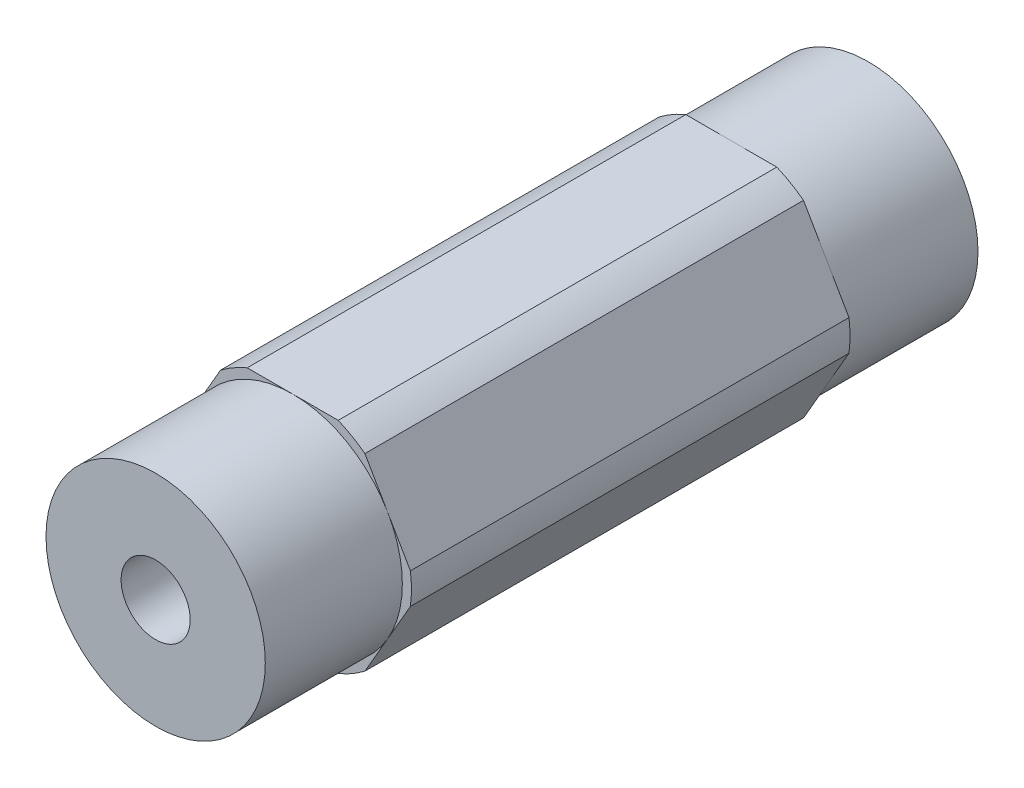
ISO-10303-21;
HEADER;
FILE_DESCRIPTION(('STEP AP214'),'2;1');
FILE_NAME('part.step','',(''),(''),'','','');
FILE_SCHEMA(('AUTOMOTIVE_DESIGN { 1 0 10303 214 1 1 1 1 }'));
ENDSEC;
DATA;
#1=APPLICATION_CONTEXT('core data for automotive mechanical design processes');
#2=APPLICATION_PROTOCOL_DEFINITION('international standard','automotive_design',2000,#1);
#3=PRODUCT_CONTEXT('',#1,'mechanical');
#4=PRODUCT('Part','Part','',(#3));
#5=PRODUCT_RELATED_PRODUCT_CATEGORY('part','',(#4));
#6=PRODUCT_DEFINITION_FORMATION('','',#4);
#7=PRODUCT_DEFINITION_CONTEXT('part definition',#1,'design');
#8=PRODUCT_DEFINITION('design','',#6,#7);
#9=PRODUCT_DEFINITION_SHAPE('','',#8);
#10=(LENGTH_UNIT() NAMED_UNIT(*) SI_UNIT(.MILLI.,.METRE.));
#11=(NAMED_UNIT(*) PLANE_ANGLE_UNIT() SI_UNIT($,.RADIAN.));
#12=(NAMED_UNIT(*) SI_UNIT($,.STERADIAN.) SOLID_ANGLE_UNIT());
#13=UNCERTAINTY_MEASURE_WITH_UNIT(LENGTH_MEASURE(1.E-05),#10,'distance_accuracy_value','');
#14=(GEOMETRIC_REPRESENTATION_CONTEXT(3) GLOBAL_UNCERTAINTY_ASSIGNED_CONTEXT((#13)) GLOBAL_UNIT_ASSIGNED_CONTEXT((#10,
#11,#12)) REPRESENTATION_CONTEXT('',''));
#15=CARTESIAN_POINT('',(0.,0.,0.));
#16=DIRECTION('',(0.,0.,1.));
#17=DIRECTION('',(1.,0.,0.));
#18=AXIS2_PLACEMENT_3D('',#15,#16,#17);
#19=CARTESIAN_POINT('',(0.,0.,-12.7));
#20=DIRECTION('',(0.,0.,1.));
#21=DIRECTION('',(1.,0.,0.));
#22=AXIS2_PLACEMENT_3D('',#19,#20,#21);
#23=PLANE('',#22);
#24=DIRECTION('',(-0.5,0.866025403784439,0.));
#25=VECTOR('',#24,1.);
#26=CARTESIAN_POINT('',(5.49926131403118,3.175,-12.7));
#27=LINE('',#26,#25);
#28=CARTESIAN_POINT('',(5.49926131403118,3.175,-12.7));
#29=VERTEX_POINT('',#28);
#30=CARTESIAN_POINT('',(4.18177084608654,5.45696042896782,-12.7));
#31=VERTEX_POINT('',#30);
#32=EDGE_CURVE('E177',#29,#31,#27,.T.);
#33=ORIENTED_EDGE('',*,*,#32,.F.);
#34=CARTESIAN_POINT('',(0.,0.,-12.7));
#35=DIRECTION('',(0.,0.,1.));
#36=DIRECTION('',(1.,0.,0.));
#37=AXIS2_PLACEMENT_3D('',#34,#35,#36);
#38=CIRCLE('',#37,6.35);
#39=CARTESIAN_POINT('',(0.,6.35,-12.7));
#40=VERTEX_POINT('',#39);
#41=EDGE_CURVE('E52',#29,#40,#38,.T.);
#42=ORIENTED_EDGE('',*,*,#41,.T.);
#43=DIRECTION('',(-1.,0.,0.));
#44=VECTOR('',#43,1.);
#45=CARTESIAN_POINT('',(0.,6.35,-12.7));
#46=LINE('',#45,#44);
#47=CARTESIAN_POINT('',(2.63498093588929,6.35,-12.7));
#48=VERTEX_POINT('',#47);
#49=EDGE_CURVE('E176',#48,#40,#46,.T.);
#50=ORIENTED_EDGE('',*,*,#49,.F.);
#51=CARTESIAN_POINT('',(0.,0.,-12.7));
#52=DIRECTION('',(0.,0.,1.));
#53=DIRECTION('',(1.,0.,0.));
#54=AXIS2_PLACEMENT_3D('',#51,#52,#53);
#55=CIRCLE('',#54,6.874999966);
#56=EDGE_CURVE('E191',#31,#48,#55,.T.);
#57=ORIENTED_EDGE('',*,*,#56,.F.);
#58=EDGE_LOOP('',(#33,#42,#50,#57));
#59=FACE_BOUND('',#58,.T.);
#60=ADVANCED_FACE('F40',(#59),#23,.F.);
#61=CARTESIAN_POINT('',(-2.63498093588929,6.35,-12.7));
#62=VERTEX_POINT('',#61);
#63=EDGE_CURVE('E184',#40,#62,#46,.T.);
#64=ORIENTED_EDGE('',*,*,#63,.F.);
#65=CARTESIAN_POINT('',(-5.49926131403118,3.175,-12.7));
#66=VERTEX_POINT('',#65);
#67=EDGE_CURVE('E11',#40,#66,#38,.T.);
#68=ORIENTED_EDGE('',*,*,#67,.T.);
#69=DIRECTION('',(-0.5,-0.866025403784438,0.));
#70=VECTOR('',#69,1.);
#71=CARTESIAN_POINT('',(-5.49926131403118,3.175,-12.7));
#72=LINE('',#71,#70);
#73=CARTESIAN_POINT('',(-4.18177084608654,5.45696042896783,-12.7));
#74=VERTEX_POINT('',#73);
#75=EDGE_CURVE('E206',#74,#66,#72,.T.);
#76=ORIENTED_EDGE('',*,*,#75,.F.);
#77=EDGE_CURVE('E186',#62,#74,#55,.T.);
#78=ORIENTED_EDGE('',*,*,#77,.F.);
#79=EDGE_LOOP('',(#64,#68,#76,#78));
#80=FACE_BOUND('',#79,.T.);
#81=ADVANCED_FACE('F185',(#80),#23,.F.);
#82=CARTESIAN_POINT('',(-6.81675178197583,0.893039571032178,-12.7));
#83=VERTEX_POINT('',#82);
#84=EDGE_CURVE('E201',#66,#83,#72,.T.);
#85=ORIENTED_EDGE('',*,*,#84,.F.);
#86=CARTESIAN_POINT('',(-5.49926131403118,-3.175,-12.7));
#87=VERTEX_POINT('',#86);
#88=EDGE_CURVE('E50',#66,#87,#38,.T.);
#89=ORIENTED_EDGE('',*,*,#88,.T.);
#90=DIRECTION('',(0.5,-0.866025403784438,0.));
#91=VECTOR('',#90,1.);
#92=CARTESIAN_POINT('',(-5.49926131403118,-3.175,-12.7));
#93=LINE('',#92,#91);
#94=CARTESIAN_POINT('',(-6.81675178197583,-0.893039571032174,-12.7));
#95=VERTEX_POINT('',#94);
#96=EDGE_CURVE('E210',#95,#87,#93,.T.);
#97=ORIENTED_EDGE('',*,*,#96,.F.);
#98=EDGE_CURVE('E203',#83,#95,#55,.T.);
#99=ORIENTED_EDGE('',*,*,#98,.F.);
#100=EDGE_LOOP('',(#85,#89,#97,#99));
#101=FACE_BOUND('',#100,.T.);
#102=ADVANCED_FACE('F464',(#101),#23,.F.);
#103=CARTESIAN_POINT('',(-4.18177084608653,-5.45696042896783,-12.7));
#104=VERTEX_POINT('',#103);
#105=EDGE_CURVE('E215',#87,#104,#93,.T.);
#106=ORIENTED_EDGE('',*,*,#105,.F.);
#107=CARTESIAN_POINT('',(0.,-6.35,-12.7));
#108=VERTEX_POINT('',#107);
#109=EDGE_CURVE('E411',#87,#108,#38,.T.);
#110=ORIENTED_EDGE('',*,*,#109,.T.);
#111=DIRECTION('',(1.,0.,0.));
#112=VECTOR('',#111,1.);
#113=CARTESIAN_POINT('',(0.,-6.35,-12.7));
#114=LINE('',#113,#112);
#115=CARTESIAN_POINT('',(-2.6349809358893,-6.35,-12.7));
#116=VERTEX_POINT('',#115);
#117=EDGE_CURVE('E216',#116,#108,#114,.T.);
#118=ORIENTED_EDGE('',*,*,#117,.F.);
#119=EDGE_CURVE('E214',#104,#116,#55,.T.);
#120=ORIENTED_EDGE('',*,*,#119,.F.);
#121=EDGE_LOOP('',(#106,#110,#118,#120));
#122=FACE_BOUND('',#121,.T.);
#123=ADVANCED_FACE('F410',(#122),#23,.F.);
#124=CARTESIAN_POINT('',(2.6349809358893,-6.35,-12.7));
#125=VERTEX_POINT('',#124);
#126=EDGE_CURVE('E221',#108,#125,#114,.T.);
#127=ORIENTED_EDGE('',*,*,#126,.F.);
#128=CARTESIAN_POINT('',(5.49926131403118,-3.175,-12.7));
#129=VERTEX_POINT('',#128);
#130=EDGE_CURVE('E305',#108,#129,#38,.T.);
#131=ORIENTED_EDGE('',*,*,#130,.T.);
#132=DIRECTION('',(0.5,0.866025403784439,0.));
#133=VECTOR('',#132,1.);
#134=CARTESIAN_POINT('',(5.49926131403119,-3.175,-12.7));
#135=LINE('',#134,#133);
#136=CARTESIAN_POINT('',(4.18177084608654,-5.45696042896782,-12.7));
#137=VERTEX_POINT('',#136);
#138=EDGE_CURVE('E222',#137,#129,#135,.T.);
#139=ORIENTED_EDGE('',*,*,#138,.F.);
#140=EDGE_CURVE('E220',#125,#137,#55,.T.);
#141=ORIENTED_EDGE('',*,*,#140,.F.);
#142=EDGE_LOOP('',(#127,#131,#139,#141));
#143=FACE_BOUND('',#142,.T.);
#144=ADVANCED_FACE('F447',(#143),#23,.F.);
#145=CARTESIAN_POINT('',(0.,0.,12.7));
#146=DIRECTION('',(0.,0.,1.));
#147=DIRECTION('',(1.,0.,0.));
#148=AXIS2_PLACEMENT_3D('',#145,#146,#147);
#149=PLANE('',#148);
#150=CARTESIAN_POINT('',(0.,0.,12.7));
#151=DIRECTION('',(0.,0.,1.));
#152=DIRECTION('',(1.,0.,0.));
#153=AXIS2_PLACEMENT_3D('',#150,#151,#152);
#154=CIRCLE('',#153,6.35);
#155=CARTESIAN_POINT('',(5.49926131403118,3.175,12.7));
#156=VERTEX_POINT('',#155);
#157=CARTESIAN_POINT('',(0.,6.35,12.7));
#158=VERTEX_POINT('',#157);
#159=EDGE_CURVE('E278',#156,#158,#154,.T.);
#160=ORIENTED_EDGE('',*,*,#159,.F.);
#161=DIRECTION('',(-0.5,0.866025403784439,0.));
#162=VECTOR('',#161,1.);
#163=CARTESIAN_POINT('',(5.49926131403118,3.175,12.7));
#164=LINE('',#163,#162);
#165=CARTESIAN_POINT('',(4.18177084608654,5.45696042896782,12.7));
#166=VERTEX_POINT('',#165);
#167=EDGE_CURVE('E376',#156,#166,#164,.T.);
#168=ORIENTED_EDGE('',*,*,#167,.T.);
#169=CARTESIAN_POINT('',(0.,0.,12.7));
#170=DIRECTION('',(0.,0.,1.));
#171=DIRECTION('',(1.,0.,0.));
#172=AXIS2_PLACEMENT_3D('',#169,#170,#171);
#173=CIRCLE('',#172,6.874999966);
#174=CARTESIAN_POINT('',(2.63498093588929,6.35,12.7));
#175=VERTEX_POINT('',#174);
#176=EDGE_CURVE('E361',#166,#175,#173,.T.);
#177=ORIENTED_EDGE('',*,*,#176,.T.);
#178=DIRECTION('',(-1.,0.,0.));
#179=VECTOR('',#178,1.);
#180=CARTESIAN_POINT('',(0.,6.35,12.7));
#181=LINE('',#180,#179);
#182=EDGE_CURVE('E364',#175,#158,#181,.T.);
#183=ORIENTED_EDGE('',*,*,#182,.T.);
#184=EDGE_LOOP('',(#160,#168,#177,#183));
#185=FACE_BOUND('',#184,.T.);
#186=ADVANCED_FACE('F444',(#185),#149,.T.);
#187=CARTESIAN_POINT('',(-5.49926131403118,3.175,12.7));
#188=VERTEX_POINT('',#187);
#189=EDGE_CURVE('E290',#158,#188,#154,.T.);
#190=ORIENTED_EDGE('',*,*,#189,.F.);
#191=CARTESIAN_POINT('',(-2.63498093588929,6.35,12.7));
#192=VERTEX_POINT('',#191);
#193=EDGE_CURVE('E365',#158,#192,#181,.T.);
#194=ORIENTED_EDGE('',*,*,#193,.T.);
#195=CARTESIAN_POINT('',(-4.18177084608654,5.45696042896783,12.7));
#196=VERTEX_POINT('',#195);
#197=EDGE_CURVE('E368',#192,#196,#173,.T.);
#198=ORIENTED_EDGE('',*,*,#197,.T.);
#199=DIRECTION('',(-0.5,-0.866025403784438,0.));
#200=VECTOR('',#199,1.);
#201=CARTESIAN_POINT('',(-5.49926131403118,3.175,12.7));
#202=LINE('',#201,#200);
#203=EDGE_CURVE('E342',#196,#188,#202,.T.);
#204=ORIENTED_EDGE('',*,*,#203,.T.);
#205=EDGE_LOOP('',(#190,#194,#198,#204));
#206=FACE_BOUND('',#205,.T.);
#207=ADVANCED_FACE('F446',(#206),#149,.T.);
#208=CARTESIAN_POINT('',(-5.49926131403118,-3.175,12.7));
#209=VERTEX_POINT('',#208);
#210=EDGE_CURVE('E300',#188,#209,#154,.T.);
#211=ORIENTED_EDGE('',*,*,#210,.F.);
#212=CARTESIAN_POINT('',(-6.81675178197583,0.893039571032178,12.7));
#213=VERTEX_POINT('',#212);
#214=EDGE_CURVE('E372',#188,#213,#202,.T.);
#215=ORIENTED_EDGE('',*,*,#214,.T.);
#216=CARTESIAN_POINT('',(-6.81675178197583,-0.893039571032174,12.7));
#217=VERTEX_POINT('',#216);
#218=EDGE_CURVE('E326',#213,#217,#173,.T.);
#219=ORIENTED_EDGE('',*,*,#218,.T.);
#220=DIRECTION('',(0.5,-0.866025403784438,0.));
#221=VECTOR('',#220,1.);
#222=CARTESIAN_POINT('',(-5.49926131403118,-3.175,12.7));
#223=LINE('',#222,#221);
#224=EDGE_CURVE('E323',#217,#209,#223,.T.);
#225=ORIENTED_EDGE('',*,*,#224,.T.);
#226=EDGE_LOOP('',(#211,#215,#219,#225));
#227=FACE_BOUND('',#226,.T.);
#228=ADVANCED_FACE('F329',(#227),#149,.T.);
#229=CARTESIAN_POINT('',(0.,-6.35,12.7));
#230=VERTEX_POINT('',#229);
#231=EDGE_CURVE('E284',#209,#230,#154,.T.);
#232=ORIENTED_EDGE('',*,*,#231,.F.);
#233=CARTESIAN_POINT('',(-4.18177084608653,-5.45696042896783,12.7));
#234=VERTEX_POINT('',#233);
#235=EDGE_CURVE('E315',#209,#234,#223,.T.);
#236=ORIENTED_EDGE('',*,*,#235,.T.);
#237=CARTESIAN_POINT('',(-2.6349809358893,-6.35,12.7));
#238=VERTEX_POINT('',#237);
#239=EDGE_CURVE('E334',#234,#238,#173,.T.);
#240=ORIENTED_EDGE('',*,*,#239,.T.);
#241=DIRECTION('',(1.,0.,0.));
#242=VECTOR('',#241,1.);
#243=CARTESIAN_POINT('',(0.,-6.35,12.7));
#244=LINE('',#243,#242);
#245=EDGE_CURVE('E318',#238,#230,#244,.T.);
#246=ORIENTED_EDGE('',*,*,#245,.T.);
#247=EDGE_LOOP('',(#232,#236,#240,#246));
#248=FACE_BOUND('',#247,.T.);
#249=ADVANCED_FACE('F314',(#248),#149,.T.);
#250=CARTESIAN_POINT('',(5.49926131403119,-3.175,12.7));
#251=VERTEX_POINT('',#250);
#252=EDGE_CURVE('E276',#230,#251,#154,.T.);
#253=ORIENTED_EDGE('',*,*,#252,.F.);
#254=CARTESIAN_POINT('',(2.6349809358893,-6.35,12.7));
#255=VERTEX_POINT('',#254);
#256=EDGE_CURVE('E337',#230,#255,#244,.T.);
#257=ORIENTED_EDGE('',*,*,#256,.T.);
#258=CARTESIAN_POINT('',(4.18177084608654,-5.45696042896782,12.7));
#259=VERTEX_POINT('',#258);
#260=EDGE_CURVE('E339',#255,#259,#173,.T.);
#261=ORIENTED_EDGE('',*,*,#260,.T.);
#262=DIRECTION('',(0.5,0.866025403784439,0.));
#263=VECTOR('',#262,1.);
#264=CARTESIAN_POINT('',(5.49926131403119,-3.175,12.7));
#265=LINE('',#264,#263);
#266=EDGE_CURVE('E346',#259,#251,#265,.T.);
#267=ORIENTED_EDGE('',*,*,#266,.T.);
#268=EDGE_LOOP('',(#253,#257,#261,#267));
#269=FACE_BOUND('',#268,.T.);
#270=ADVANCED_FACE('F459',(#269),#149,.T.);
#271=CARTESIAN_POINT('',(5.49926131403118,3.175,12.7));
#272=DIRECTION('',(-0.866025403784438,-0.5,0.));
#273=DIRECTION('',(0.5,-0.866025403784439,0.));
#274=AXIS2_PLACEMENT_3D('',#271,#272,#273);
#275=PLANE('',#274);
#276=CARTESIAN_POINT('',(6.81675178197583,0.89303957103218,-12.7));
#277=VERTEX_POINT('',#276);
#278=EDGE_CURVE('E350',#277,#29,#27,.T.);
#279=ORIENTED_EDGE('',*,*,#278,.T.);
#280=ORIENTED_EDGE('',*,*,#32,.T.);
#281=DIRECTION('',(0.,0.,-1.));
#282=VECTOR('',#281,1.);
#283=CARTESIAN_POINT('',(4.18177084608654,5.45696042896782,12.7));
#284=LINE('',#283,#282);
#285=EDGE_CURVE('E44',#166,#31,#284,.T.);
#286=ORIENTED_EDGE('',*,*,#285,.F.);
#287=ORIENTED_EDGE('',*,*,#167,.F.);
#288=CARTESIAN_POINT('',(6.81675178197583,0.89303957103218,12.7));
#289=VERTEX_POINT('',#288);
#290=EDGE_CURVE('E374',#289,#156,#164,.T.);
#291=ORIENTED_EDGE('',*,*,#290,.F.);
#292=DIRECTION('',(0.,0.,-1.));
#293=VECTOR('',#292,1.);
#294=CARTESIAN_POINT('',(6.81675178197583,0.89303957103218,12.7));
#295=LINE('',#294,#293);
#296=EDGE_CURVE('E228',#289,#277,#295,.T.);
#297=ORIENTED_EDGE('',*,*,#296,.T.);
#298=EDGE_LOOP('',(#279,#280,#286,#287,#291,#297));
#299=FACE_BOUND('',#298,.T.);
#300=ADVANCED_FACE('F358',(#299),#275,.F.);
#301=CARTESIAN_POINT('',(0.,0.,12.7));
#302=DIRECTION('',(0.,0.,-1.));
#303=DIRECTION('',(-1.,0.,0.));
#304=AXIS2_PLACEMENT_3D('',#301,#302,#303);
#305=CYLINDRICAL_SURFACE('',#304,6.874999966);
#306=ORIENTED_EDGE('',*,*,#56,.T.);
#307=DIRECTION('',(0.,0.,-1.));
#308=VECTOR('',#307,1.);
#309=CARTESIAN_POINT('',(2.63498093588929,6.35,12.7));
#310=LINE('',#309,#308);
#311=EDGE_CURVE('E197',#175,#48,#310,.T.);
#312=ORIENTED_EDGE('',*,*,#311,.F.);
#313=ORIENTED_EDGE('',*,*,#176,.F.);
#314=ORIENTED_EDGE('',*,*,#285,.T.);
#315=EDGE_LOOP('',(#306,#312,#313,#314));
#316=FACE_BOUND('',#315,.T.);
#317=ADVANCED_FACE('F360',(#316),#305,.T.);
#318=CARTESIAN_POINT('',(0.,6.35,12.7));
#319=DIRECTION('',(0.,-1.,0.));
#320=DIRECTION('',(0.,0.,-1.));
#321=AXIS2_PLACEMENT_3D('',#318,#319,#320);
#322=PLANE('',#321);
#323=ORIENTED_EDGE('',*,*,#49,.T.);
#324=ORIENTED_EDGE('',*,*,#63,.T.);
#325=DIRECTION('',(0.,0.,-1.));
#326=VECTOR('',#325,1.);
#327=CARTESIAN_POINT('',(-2.63498093588929,6.35,12.7));
#328=LINE('',#327,#326);
#329=EDGE_CURVE('E265',#192,#62,#328,.T.);
#330=ORIENTED_EDGE('',*,*,#329,.F.);
#331=ORIENTED_EDGE('',*,*,#193,.F.);
#332=ORIENTED_EDGE('',*,*,#182,.F.);
#333=ORIENTED_EDGE('',*,*,#311,.T.);
#334=EDGE_LOOP('',(#323,#324,#330,#331,#332,#333));
#335=FACE_BOUND('',#334,.T.);
#336=ADVANCED_FACE('F194',(#335),#322,.F.);
#337=ORIENTED_EDGE('',*,*,#77,.T.);
#338=DIRECTION('',(0.,0.,-1.));
#339=VECTOR('',#338,1.);
#340=CARTESIAN_POINT('',(-4.18177084608654,5.45696042896783,12.7));
#341=LINE('',#340,#339);
#342=EDGE_CURVE('E261',#196,#74,#341,.T.);
#343=ORIENTED_EDGE('',*,*,#342,.F.);
#344=ORIENTED_EDGE('',*,*,#197,.F.);
#345=ORIENTED_EDGE('',*,*,#329,.T.);
#346=EDGE_LOOP('',(#337,#343,#344,#345));
#347=FACE_BOUND('',#346,.T.);
#348=ADVANCED_FACE('F517',(#347),#305,.T.);
#349=CARTESIAN_POINT('',(-5.49926131403118,3.175,12.7));
#350=DIRECTION('',(0.866025403784438,-0.5,0.));
#351=DIRECTION('',(0.5,0.866025403784438,0.));
#352=AXIS2_PLACEMENT_3D('',#349,#350,#351);
#353=PLANE('',#352);
#354=ORIENTED_EDGE('',*,*,#75,.T.);
#355=ORIENTED_EDGE('',*,*,#84,.T.);
#356=DIRECTION('',(0.,0.,-1.));
#357=VECTOR('',#356,1.);
#358=CARTESIAN_POINT('',(-6.81675178197583,0.893039571032178,12.7));
#359=LINE('',#358,#357);
#360=EDGE_CURVE('E257',#213,#83,#359,.T.);
#361=ORIENTED_EDGE('',*,*,#360,.F.);
#362=ORIENTED_EDGE('',*,*,#214,.F.);
#363=ORIENTED_EDGE('',*,*,#203,.F.);
#364=ORIENTED_EDGE('',*,*,#342,.T.);
#365=EDGE_LOOP('',(#354,#355,#361,#362,#363,#364));
#366=FACE_BOUND('',#365,.T.);
#367=ADVANCED_FACE('F514',(#366),#353,.F.);
#368=ORIENTED_EDGE('',*,*,#98,.T.);
#369=DIRECTION('',(0.,0.,-1.));
#370=VECTOR('',#369,1.);
#371=CARTESIAN_POINT('',(-6.81675178197583,-0.893039571032174,12.7));
#372=LINE('',#371,#370);
#373=EDGE_CURVE('E253',#217,#95,#372,.T.);
#374=ORIENTED_EDGE('',*,*,#373,.F.);
#375=ORIENTED_EDGE('',*,*,#218,.F.);
#376=ORIENTED_EDGE('',*,*,#360,.T.);
#377=EDGE_LOOP('',(#368,#374,#375,#376));
#378=FACE_BOUND('',#377,.T.);
#379=ADVANCED_FACE('F513',(#378),#305,.T.);
#380=CARTESIAN_POINT('',(-5.49926131403118,-3.175,12.7));
#381=DIRECTION('',(0.866025403784438,0.5,0.));
#382=DIRECTION('',(-0.5,0.866025403784438,0.));
#383=AXIS2_PLACEMENT_3D('',#380,#381,#382);
#384=PLANE('',#383);
#385=ORIENTED_EDGE('',*,*,#96,.T.);
#386=ORIENTED_EDGE('',*,*,#105,.T.);
#387=DIRECTION('',(0.,0.,-1.));
#388=VECTOR('',#387,1.);
#389=CARTESIAN_POINT('',(-4.18177084608653,-5.45696042896783,12.7));
#390=LINE('',#389,#388);
#391=EDGE_CURVE('E249',#234,#104,#390,.T.);
#392=ORIENTED_EDGE('',*,*,#391,.F.);
#393=ORIENTED_EDGE('',*,*,#235,.F.);
#394=ORIENTED_EDGE('',*,*,#224,.F.);
#395=ORIENTED_EDGE('',*,*,#373,.T.);
#396=EDGE_LOOP('',(#385,#386,#392,#393,#394,#395));
#397=FACE_BOUND('',#396,.T.);
#398=ADVANCED_FACE('F322',(#397),#384,.F.);
#399=ORIENTED_EDGE('',*,*,#119,.T.);
#400=DIRECTION('',(0.,0.,-1.));
#401=VECTOR('',#400,1.);
#402=CARTESIAN_POINT('',(-2.6349809358893,-6.35,12.7));
#403=LINE('',#402,#401);
#404=EDGE_CURVE('E245',#238,#116,#403,.T.);
#405=ORIENTED_EDGE('',*,*,#404,.F.);
#406=ORIENTED_EDGE('',*,*,#239,.F.);
#407=ORIENTED_EDGE('',*,*,#391,.T.);
#408=EDGE_LOOP('',(#399,#405,#406,#407));
#409=FACE_BOUND('',#408,.T.);
#410=ADVANCED_FACE('F408',(#409),#305,.T.);
#411=CARTESIAN_POINT('',(0.,-6.35,12.7));
#412=DIRECTION('',(0.,1.,0.));
#413=DIRECTION('',(0.,0.,1.));
#414=AXIS2_PLACEMENT_3D('',#411,#412,#413);
#415=PLANE('',#414);
#416=ORIENTED_EDGE('',*,*,#117,.T.);
#417=ORIENTED_EDGE('',*,*,#126,.T.);
#418=DIRECTION('',(0.,0.,-1.));
#419=VECTOR('',#418,1.);
#420=CARTESIAN_POINT('',(2.6349809358893,-6.35,12.7));
#421=LINE('',#420,#419);
#422=EDGE_CURVE('E241',#255,#125,#421,.T.);
#423=ORIENTED_EDGE('',*,*,#422,.F.);
#424=ORIENTED_EDGE('',*,*,#256,.F.);
#425=ORIENTED_EDGE('',*,*,#245,.F.);
#426=ORIENTED_EDGE('',*,*,#404,.T.);
#427=EDGE_LOOP('',(#416,#417,#423,#424,#425,#426));
#428=FACE_BOUND('',#427,.T.);
#429=ADVANCED_FACE('F414',(#428),#415,.F.);
#430=ORIENTED_EDGE('',*,*,#140,.T.);
#431=DIRECTION('',(0.,0.,-1.));
#432=VECTOR('',#431,1.);
#433=CARTESIAN_POINT('',(4.18177084608654,-5.45696042896782,12.7));
#434=LINE('',#433,#432);
#435=EDGE_CURVE('E237',#259,#137,#434,.T.);
#436=ORIENTED_EDGE('',*,*,#435,.F.);
#437=ORIENTED_EDGE('',*,*,#260,.F.);
#438=ORIENTED_EDGE('',*,*,#422,.T.);
#439=EDGE_LOOP('',(#430,#436,#437,#438));
#440=FACE_BOUND('',#439,.T.);
#441=ADVANCED_FACE('F501',(#440),#305,.T.);
#442=CARTESIAN_POINT('',(5.49926131403119,-3.175,12.7));
#443=DIRECTION('',(-0.866025403784439,0.5,0.));
#444=DIRECTION('',(-0.5,-0.866025403784439,0.));
#445=AXIS2_PLACEMENT_3D('',#442,#443,#444);
#446=PLANE('',#445);
#447=ORIENTED_EDGE('',*,*,#138,.T.);
#448=CARTESIAN_POINT('',(6.81675178197583,-0.893039571032182,-12.7));
#449=VERTEX_POINT('',#448);
#450=EDGE_CURVE('E227',#129,#449,#135,.T.);
#451=ORIENTED_EDGE('',*,*,#450,.T.);
#452=DIRECTION('',(0.,0.,-1.));
#453=VECTOR('',#452,1.);
#454=CARTESIAN_POINT('',(6.81675178197583,-0.893039571032182,12.7));
#455=LINE('',#454,#453);
#456=CARTESIAN_POINT('',(6.81675178197583,-0.893039571032182,12.7));
#457=VERTEX_POINT('',#456);
#458=EDGE_CURVE('E232',#457,#449,#455,.T.);
#459=ORIENTED_EDGE('',*,*,#458,.F.);
#460=EDGE_CURVE('E349',#251,#457,#265,.T.);
#461=ORIENTED_EDGE('',*,*,#460,.F.);
#462=ORIENTED_EDGE('',*,*,#266,.F.);
#463=ORIENTED_EDGE('',*,*,#435,.T.);
#464=EDGE_LOOP('',(#447,#451,#459,#461,#462,#463));
#465=FACE_BOUND('',#464,.T.);
#466=ADVANCED_FACE('F477',(#465),#446,.F.);
#467=CARTESIAN_POINT('',(0.,0.,12.7));
#468=DIRECTION('',(0.,0.,-1.));
#469=DIRECTION('',(-1.,0.,0.));
#470=AXIS2_PLACEMENT_3D('',#467,#468,#469);
#471=CYLINDRICAL_SURFACE('',#470,2.000000064);
#472=CARTESIAN_POINT('',(0.,0.,20.6375));
#473=DIRECTION('',(0.,0.,1.));
#474=DIRECTION('',(1.,0.,0.));
#475=AXIS2_PLACEMENT_3D('',#472,#473,#474);
#476=CIRCLE('',#475,2.000000064);
#477=CARTESIAN_POINT('',(2.000000064,0.,20.6375));
#478=VERTEX_POINT('',#477);
#479=EDGE_CURVE('E289',#478,#478,#476,.T.);
#480=ORIENTED_EDGE('',*,*,#479,.T.);
#481=EDGE_LOOP('',(#480));
#482=FACE_BOUND('',#481,.T.);
#483=CARTESIAN_POINT('',(0.,0.,-20.6375));
#484=DIRECTION('',(0.,0.,1.));
#485=DIRECTION('',(1.,0.,0.));
#486=AXIS2_PLACEMENT_3D('',#483,#484,#485);
#487=CIRCLE('',#486,2.000000064);
#488=CARTESIAN_POINT('',(2.000000064,0.,-20.6375));
#489=VERTEX_POINT('',#488);
#490=EDGE_CURVE('E181',#489,#489,#487,.T.);
#491=ORIENTED_EDGE('',*,*,#490,.F.);
#492=EDGE_LOOP('',(#491));
#493=FACE_BOUND('',#492,.T.);
#494=ADVANCED_FACE('F42',(#482,#493),#471,.F.);
#495=EDGE_CURVE('E226',#449,#277,#55,.T.);
#496=ORIENTED_EDGE('',*,*,#495,.T.);
#497=ORIENTED_EDGE('',*,*,#296,.F.);
#498=EDGE_CURVE('E233',#457,#289,#173,.T.);
#499=ORIENTED_EDGE('',*,*,#498,.F.);
#500=ORIENTED_EDGE('',*,*,#458,.T.);
#501=EDGE_LOOP('',(#496,#497,#499,#500));
#502=FACE_BOUND('',#501,.T.);
#503=ADVANCED_FACE('F443',(#502),#305,.T.);
#504=EDGE_CURVE('E66',#251,#156,#154,.T.);
#505=ORIENTED_EDGE('',*,*,#504,.F.);
#506=ORIENTED_EDGE('',*,*,#460,.T.);
#507=ORIENTED_EDGE('',*,*,#498,.T.);
#508=ORIENTED_EDGE('',*,*,#290,.T.);
#509=EDGE_LOOP('',(#505,#506,#507,#508));
#510=FACE_BOUND('',#509,.T.);
#511=ADVANCED_FACE('F441',(#510),#149,.T.);
#512=ORIENTED_EDGE('',*,*,#450,.F.);
#513=EDGE_CURVE('E182',#129,#29,#38,.T.);
#514=ORIENTED_EDGE('',*,*,#513,.T.);
#515=ORIENTED_EDGE('',*,*,#278,.F.);
#516=ORIENTED_EDGE('',*,*,#495,.F.);
#517=EDGE_LOOP('',(#512,#514,#515,#516));
#518=FACE_BOUND('',#517,.T.);
#519=ADVANCED_FACE('F456',(#518),#23,.F.);
#520=CARTESIAN_POINT('',(0.,0.,20.6375));
#521=DIRECTION('',(0.,0.,1.));
#522=DIRECTION('',(1.,0.,0.));
#523=AXIS2_PLACEMENT_3D('',#520,#521,#522);
#524=PLANE('',#523);
#525=CARTESIAN_POINT('',(0.,0.,20.6375));
#526=DIRECTION('',(0.,0.,1.));
#527=DIRECTION('',(1.,0.,0.));
#528=AXIS2_PLACEMENT_3D('',#525,#526,#527);
#529=CIRCLE('',#528,6.35);
#530=CARTESIAN_POINT('',(6.35,0.,20.6375));
#531=VERTEX_POINT('',#530);
#532=EDGE_CURVE('E288',#531,#531,#529,.T.);
#533=ORIENTED_EDGE('',*,*,#532,.T.);
#534=EDGE_LOOP('',(#533));
#535=FACE_BOUND('',#534,.T.);
#536=ORIENTED_EDGE('',*,*,#479,.F.);
#537=EDGE_LOOP('',(#536));
#538=FACE_BOUND('',#537,.T.);
#539=ADVANCED_FACE('F467',(#535,#538),#524,.T.);
#540=CARTESIAN_POINT('',(0.,0.,20.6375));
#541=DIRECTION('',(0.,0.,-1.));
#542=DIRECTION('',(-1.,0.,0.));
#543=AXIS2_PLACEMENT_3D('',#540,#541,#542);
#544=CYLINDRICAL_SURFACE('',#543,6.35);
#545=ORIENTED_EDGE('',*,*,#532,.F.);
#546=EDGE_LOOP('',(#545));
#547=FACE_BOUND('',#546,.T.);
#548=ORIENTED_EDGE('',*,*,#159,.T.);
#549=ORIENTED_EDGE('',*,*,#189,.T.);
#550=ORIENTED_EDGE('',*,*,#210,.T.);
#551=ORIENTED_EDGE('',*,*,#231,.T.);
#552=ORIENTED_EDGE('',*,*,#252,.T.);
#553=ORIENTED_EDGE('',*,*,#504,.T.);
#554=EDGE_LOOP('',(#548,#549,#550,#551,#552,#553));
#555=FACE_BOUND('',#554,.T.);
#556=ADVANCED_FACE('F310',(#547,#555),#544,.T.);
#557=CARTESIAN_POINT('',(0.,0.,-20.6375));
#558=DIRECTION('',(0.,0.,1.));
#559=DIRECTION('',(1.,0.,0.));
#560=AXIS2_PLACEMENT_3D('',#557,#558,#559);
#561=CYLINDRICAL_SURFACE('',#560,6.35);
#562=CARTESIAN_POINT('',(0.,0.,-20.6375));
#563=DIRECTION('',(0.,0.,1.));
#564=DIRECTION('',(1.,0.,0.));
#565=AXIS2_PLACEMENT_3D('',#562,#563,#564);
#566=CIRCLE('',#565,6.35);
#567=CARTESIAN_POINT('',(6.35,0.,-20.6375));
#568=VERTEX_POINT('',#567);
#569=EDGE_CURVE('E180',#568,#568,#566,.T.);
#570=ORIENTED_EDGE('',*,*,#569,.T.);
#571=EDGE_LOOP('',(#570));
#572=FACE_BOUND('',#571,.T.);
#573=ORIENTED_EDGE('',*,*,#41,.F.);
#574=ORIENTED_EDGE('',*,*,#513,.F.);
#575=ORIENTED_EDGE('',*,*,#130,.F.);
#576=ORIENTED_EDGE('',*,*,#109,.F.);
#577=ORIENTED_EDGE('',*,*,#88,.F.);
#578=ORIENTED_EDGE('',*,*,#67,.F.);
#579=EDGE_LOOP('',(#573,#574,#575,#576,#577,#578));
#580=FACE_BOUND('',#579,.T.);
#581=ADVANCED_FACE('F165',(#572,#580),#561,.T.);
#582=CARTESIAN_POINT('',(0.,0.,-20.6375));
#583=DIRECTION('',(0.,0.,-1.));
#584=DIRECTION('',(1.,0.,0.));
#585=AXIS2_PLACEMENT_3D('',#582,#583,#584);
#586=PLANE('',#585);
#587=ORIENTED_EDGE('',*,*,#490,.T.);
#588=EDGE_LOOP('',(#587));
#589=FACE_BOUND('',#588,.T.);
#590=ORIENTED_EDGE('',*,*,#569,.F.);
#591=EDGE_LOOP('',(#590));
#592=FACE_BOUND('',#591,.T.);
#593=ADVANCED_FACE('F492',(#589,#592),#586,.T.);
#594=CLOSED_SHELL('',(#60,#81,#102,#123,#144,#186,#207,#228,#249,#270,#300,#317,#336,#348,#367,
#379,#398,#410,#429,#441,#466,#494,#503,#511,#519,#539,#556,#581,#593));
#595=MANIFOLD_SOLID_BREP('B2',#594);
#596=ADVANCED_BREP_SHAPE_REPRESENTATION('',(#18,#595),#14);
#597=SHAPE_DEFINITION_REPRESENTATION(#9,#596);
ENDSEC;
END-ISO-10303-21;
